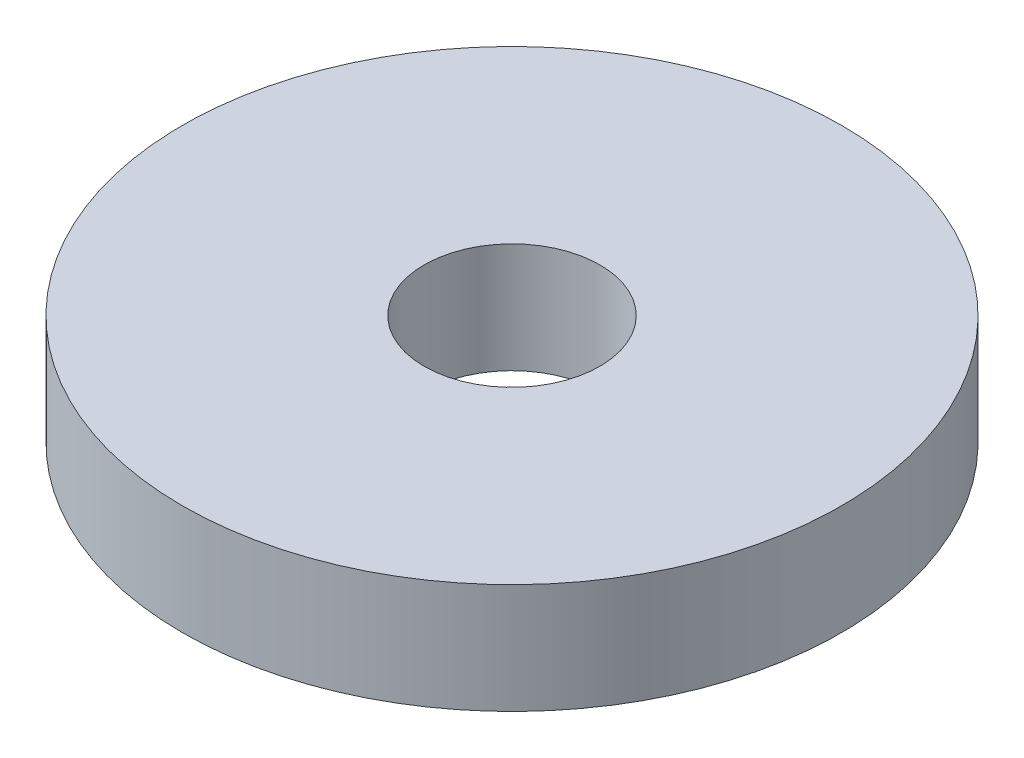
ISO-10303-21;
HEADER;
FILE_DESCRIPTION(('STEP AP214'),'2;1');
FILE_NAME('part.step','',(''),(''),'','','');
FILE_SCHEMA(('AUTOMOTIVE_DESIGN { 1 0 10303 214 1 1 1 1 }'));
ENDSEC;
DATA;
#1=APPLICATION_CONTEXT('core data for automotive mechanical design processes');
#2=APPLICATION_PROTOCOL_DEFINITION('international standard','automotive_design',2000,#1);
#3=PRODUCT_CONTEXT('',#1,'mechanical');
#4=PRODUCT('Part','Part','',(#3));
#5=PRODUCT_RELATED_PRODUCT_CATEGORY('part','',(#4));
#6=PRODUCT_DEFINITION_FORMATION('','',#4);
#7=PRODUCT_DEFINITION_CONTEXT('part definition',#1,'design');
#8=PRODUCT_DEFINITION('design','',#6,#7);
#9=PRODUCT_DEFINITION_SHAPE('','',#8);
#10=(LENGTH_UNIT() NAMED_UNIT(*) SI_UNIT(.MILLI.,.METRE.));
#11=(NAMED_UNIT(*) PLANE_ANGLE_UNIT() SI_UNIT($,.RADIAN.));
#12=(NAMED_UNIT(*) SI_UNIT($,.STERADIAN.) SOLID_ANGLE_UNIT());
#13=UNCERTAINTY_MEASURE_WITH_UNIT(LENGTH_MEASURE(1.E-05),#10,'distance_accuracy_value','');
#14=(GEOMETRIC_REPRESENTATION_CONTEXT(3) GLOBAL_UNCERTAINTY_ASSIGNED_CONTEXT((#13)) GLOBAL_UNIT_ASSIGNED_CONTEXT((#10,
#11,#12)) REPRESENTATION_CONTEXT('',''));
#15=CARTESIAN_POINT('',(0.,0.,0.));
#16=DIRECTION('',(0.,0.,1.));
#17=DIRECTION('',(1.,0.,0.));
#18=AXIS2_PLACEMENT_3D('',#15,#16,#17);
#19=CARTESIAN_POINT('',(0.,5.,0.));
#20=DIRECTION('',(0.,1.,0.));
#21=DIRECTION('',(0.,0.,1.));
#22=AXIS2_PLACEMENT_3D('',#19,#20,#21);
#23=PLANE('',#22);
#24=CARTESIAN_POINT('',(0.,5.,0.));
#25=DIRECTION('',(0.,1.,0.));
#26=DIRECTION('',(0.,0.,1.));
#27=AXIS2_PLACEMENT_3D('',#24,#25,#26);
#28=CIRCLE('',#27,15.);
#29=CARTESIAN_POINT('',(0.,5.,15.));
#30=VERTEX_POINT('',#29);
#31=EDGE_CURVE('E11',#30,#30,#28,.T.);
#32=ORIENTED_EDGE('',*,*,#31,.T.);
#33=EDGE_LOOP('',(#32));
#34=FACE_BOUND('',#33,.T.);
#35=CARTESIAN_POINT('',(0.,5.,0.));
#36=DIRECTION('',(0.,1.,0.));
#37=DIRECTION('',(0.,0.,1.));
#38=AXIS2_PLACEMENT_3D('',#35,#36,#37);
#39=CIRCLE('',#38,4.);
#40=CARTESIAN_POINT('',(0.,5.,4.));
#41=VERTEX_POINT('',#40);
#42=EDGE_CURVE('E47',#41,#41,#39,.T.);
#43=ORIENTED_EDGE('',*,*,#42,.F.);
#44=EDGE_LOOP('',(#43));
#45=FACE_BOUND('',#44,.T.);
#46=ADVANCED_FACE('F34',(#34,#45),#23,.T.);
#47=CARTESIAN_POINT('',(0.,0.,0.));
#48=DIRECTION('',(0.,1.,0.));
#49=DIRECTION('',(0.,0.,1.));
#50=AXIS2_PLACEMENT_3D('',#47,#48,#49);
#51=PLANE('',#50);
#52=CARTESIAN_POINT('',(0.,0.,0.));
#53=DIRECTION('',(0.,1.,0.));
#54=DIRECTION('',(0.,0.,1.));
#55=AXIS2_PLACEMENT_3D('',#52,#53,#54);
#56=CIRCLE('',#55,15.);
#57=CARTESIAN_POINT('',(0.,0.,15.));
#58=VERTEX_POINT('',#57);
#59=EDGE_CURVE('E38',#58,#58,#56,.T.);
#60=ORIENTED_EDGE('',*,*,#59,.F.);
#61=EDGE_LOOP('',(#60));
#62=FACE_BOUND('',#61,.T.);
#63=CARTESIAN_POINT('',(0.,0.,0.));
#64=DIRECTION('',(0.,1.,0.));
#65=DIRECTION('',(0.,0.,1.));
#66=AXIS2_PLACEMENT_3D('',#63,#64,#65);
#67=CIRCLE('',#66,4.);
#68=CARTESIAN_POINT('',(0.,0.,4.));
#69=VERTEX_POINT('',#68);
#70=EDGE_CURVE('E50',#69,#69,#67,.T.);
#71=ORIENTED_EDGE('',*,*,#70,.T.);
#72=EDGE_LOOP('',(#71));
#73=FACE_BOUND('',#72,.T.);
#74=ADVANCED_FACE('F60',(#62,#73),#51,.F.);
#75=CARTESIAN_POINT('',(0.,5.,0.));
#76=DIRECTION('',(0.,-1.,0.));
#77=DIRECTION('',(0.,0.,-1.));
#78=AXIS2_PLACEMENT_3D('',#75,#76,#77);
#79=CYLINDRICAL_SURFACE('',#78,15.);
#80=ORIENTED_EDGE('',*,*,#31,.F.);
#81=EDGE_LOOP('',(#80));
#82=FACE_BOUND('',#81,.T.);
#83=ORIENTED_EDGE('',*,*,#59,.T.);
#84=EDGE_LOOP('',(#83));
#85=FACE_BOUND('',#84,.T.);
#86=ADVANCED_FACE('F36',(#82,#85),#79,.T.);
#87=CARTESIAN_POINT('',(0.,5.,0.));
#88=DIRECTION('',(0.,-1.,0.));
#89=DIRECTION('',(0.,0.,-1.));
#90=AXIS2_PLACEMENT_3D('',#87,#88,#89);
#91=CYLINDRICAL_SURFACE('',#90,4.);
#92=ORIENTED_EDGE('',*,*,#42,.T.);
#93=EDGE_LOOP('',(#92));
#94=FACE_BOUND('',#93,.T.);
#95=ORIENTED_EDGE('',*,*,#70,.F.);
#96=EDGE_LOOP('',(#95));
#97=FACE_BOUND('',#96,.T.);
#98=ADVANCED_FACE('F56',(#94,#97),#91,.F.);
#99=CLOSED_SHELL('',(#46,#74,#86,#98));
#100=MANIFOLD_SOLID_BREP('B2',#99);
#101=ADVANCED_BREP_SHAPE_REPRESENTATION('',(#18,#100),#14);
#102=SHAPE_DEFINITION_REPRESENTATION(#9,#101);
ENDSEC;
END-ISO-10303-21;
